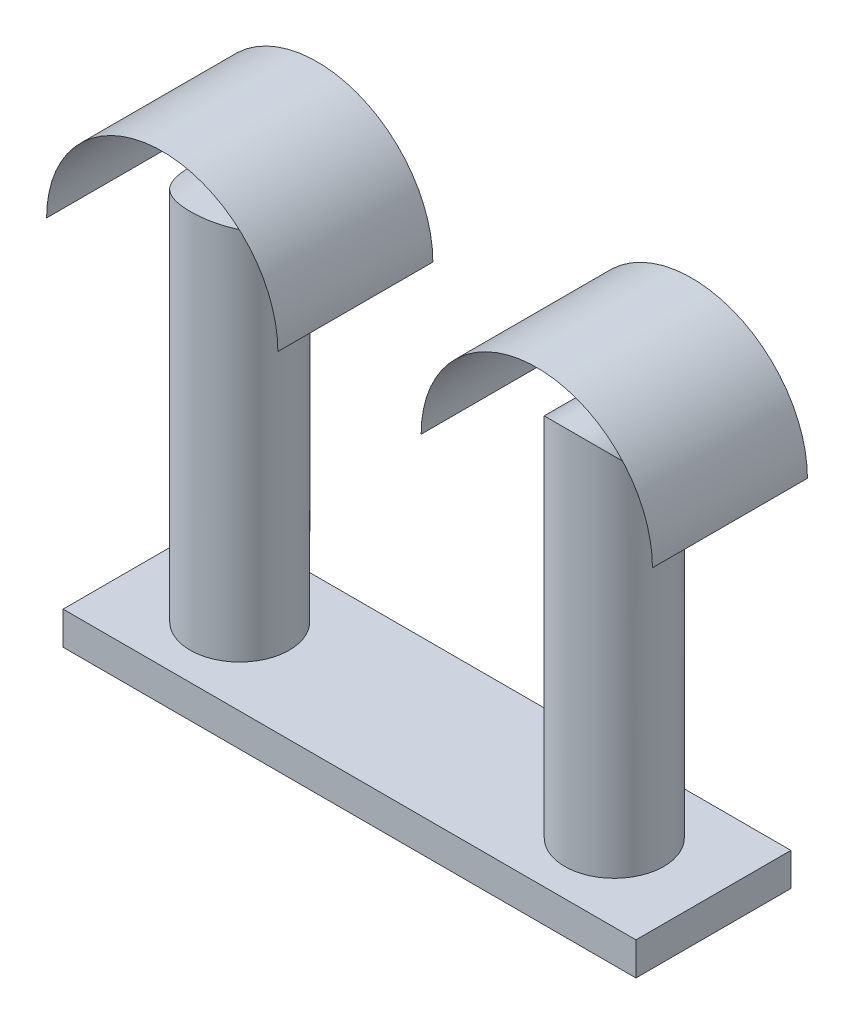
ISO-10303-21;
HEADER;
FILE_DESCRIPTION(('STEP AP214'),'2;1');
FILE_NAME('part.step','',(''),(''),'','','');
FILE_SCHEMA(('AUTOMOTIVE_DESIGN { 1 0 10303 214 1 1 1 1 }'));
ENDSEC;
DATA;
#1=APPLICATION_CONTEXT('core data for automotive mechanical design processes');
#2=APPLICATION_PROTOCOL_DEFINITION('international standard','automotive_design',2000,#1);
#3=PRODUCT_CONTEXT('',#1,'mechanical');
#4=PRODUCT('Part','Part','',(#3));
#5=PRODUCT_RELATED_PRODUCT_CATEGORY('part','',(#4));
#6=PRODUCT_DEFINITION_FORMATION('','',#4);
#7=PRODUCT_DEFINITION_CONTEXT('part definition',#1,'design');
#8=PRODUCT_DEFINITION('design','',#6,#7);
#9=PRODUCT_DEFINITION_SHAPE('','',#8);
#10=(LENGTH_UNIT() NAMED_UNIT(*) SI_UNIT(.MILLI.,.METRE.));
#11=(NAMED_UNIT(*) PLANE_ANGLE_UNIT() SI_UNIT($,.RADIAN.));
#12=(NAMED_UNIT(*) SI_UNIT($,.STERADIAN.) SOLID_ANGLE_UNIT());
#13=UNCERTAINTY_MEASURE_WITH_UNIT(LENGTH_MEASURE(1.E-05),#10,'distance_accuracy_value','');
#14=(GEOMETRIC_REPRESENTATION_CONTEXT(3) GLOBAL_UNCERTAINTY_ASSIGNED_CONTEXT((#13)) GLOBAL_UNIT_ASSIGNED_CONTEXT((#10,
#11,#12)) REPRESENTATION_CONTEXT('',''));
#15=CARTESIAN_POINT('',(0.,0.,0.));
#16=DIRECTION('',(0.,0.,1.));
#17=DIRECTION('',(1.,0.,0.));
#18=AXIS2_PLACEMENT_3D('',#15,#16,#17);
#19=CARTESIAN_POINT('',(56.6767208133692,110.,0.));
#20=DIRECTION('',(0.,0.,1.));
#21=DIRECTION('',(-1.,0.,0.));
#22=AXIS2_PLACEMENT_3D('',#19,#20,#21);
#23=CYLINDRICAL_SURFACE('',#22,35.);
#24=CARTESIAN_POINT('',(56.6767208133692,110.,23.447135678392));
#25=DIRECTION('',(0.,0.,1.));
#26=DIRECTION('',(1.,0.,0.));
#27=AXIS2_PLACEMENT_3D('',#24,#25,#26);
#28=CIRCLE('',#27,35.);
#29=CARTESIAN_POINT('',(91.6767208133692,110.,23.447135678392));
#30=VERTEX_POINT('',#29);
#31=CARTESIAN_POINT('',(21.6767208133692,110.,23.447135678392));
#32=VERTEX_POINT('',#31);
#33=EDGE_CURVE('E73',#30,#32,#28,.T.);
#34=ORIENTED_EDGE('',*,*,#33,.T.);
#35=DIRECTION('',(0.,0.,1.));
#36=VECTOR('',#35,1.);
#37=CARTESIAN_POINT('',(21.6767208133692,110.,0.));
#38=LINE('',#37,#36);
#39=CARTESIAN_POINT('',(21.6767208133692,110.,-23.447135678392));
#40=VERTEX_POINT('',#39);
#41=EDGE_CURVE('E14',#40,#32,#38,.T.);
#42=ORIENTED_EDGE('',*,*,#41,.F.);
#43=CARTESIAN_POINT('',(56.6767208133692,110.,-23.447135678392));
#44=DIRECTION('',(0.,0.,1.));
#45=DIRECTION('',(1.,0.,0.));
#46=AXIS2_PLACEMENT_3D('',#43,#44,#45);
#47=CIRCLE('',#46,35.);
#48=CARTESIAN_POINT('',(91.6767208133692,110.,-23.447135678392));
#49=VERTEX_POINT('',#48);
#50=EDGE_CURVE('E74',#49,#40,#47,.T.);
#51=ORIENTED_EDGE('',*,*,#50,.F.);
#52=DIRECTION('',(0.,0.,1.));
#53=VECTOR('',#52,1.);
#54=CARTESIAN_POINT('',(91.6767208133692,110.,0.));
#55=LINE('',#54,#53);
#56=EDGE_CURVE('E54',#49,#30,#55,.T.);
#57=ORIENTED_EDGE('',*,*,#56,.T.);
#58=EDGE_LOOP('',(#34,#42,#51,#57));
#59=FACE_BOUND('',#58,.T.);
#60=ADVANCED_FACE('F53',(#59),#23,.F.);
#61=OPEN_SHELL('',(#60));
#62=SHELL_BASED_SURFACE_MODEL('B2',(#61));
#63=CARTESIAN_POINT('',(-56.6767208133692,110.,0.));
#64=DIRECTION('',(0.,0.,1.));
#65=DIRECTION('',(1.,0.,0.));
#66=AXIS2_PLACEMENT_3D('',#63,#64,#65);
#67=CYLINDRICAL_SURFACE('',#66,35.);
#68=CARTESIAN_POINT('',(-56.6767208133692,110.,23.447135678392));
#69=DIRECTION('',(0.,0.,-1.));
#70=DIRECTION('',(-1.,0.,0.));
#71=AXIS2_PLACEMENT_3D('',#68,#69,#70);
#72=CIRCLE('',#71,35.);
#73=CARTESIAN_POINT('',(-91.6767208133692,110.,23.447135678392));
#74=VERTEX_POINT('',#73);
#75=CARTESIAN_POINT('',(-21.6767208133692,110.,23.447135678392));
#76=VERTEX_POINT('',#75);
#77=EDGE_CURVE('E117',#74,#76,#72,.T.);
#78=ORIENTED_EDGE('',*,*,#77,.F.);
#79=DIRECTION('',(0.,0.,1.));
#80=VECTOR('',#79,1.);
#81=CARTESIAN_POINT('',(-91.6767208133692,110.,0.));
#82=LINE('',#81,#80);
#83=CARTESIAN_POINT('',(-91.6767208133692,110.,-23.447135678392));
#84=VERTEX_POINT('',#83);
#85=EDGE_CURVE('E109',#84,#74,#82,.T.);
#86=ORIENTED_EDGE('',*,*,#85,.F.);
#87=CARTESIAN_POINT('',(-56.6767208133692,110.,-23.447135678392));
#88=DIRECTION('',(0.,0.,-1.));
#89=DIRECTION('',(-1.,0.,0.));
#90=AXIS2_PLACEMENT_3D('',#87,#88,#89);
#91=CIRCLE('',#90,35.);
#92=CARTESIAN_POINT('',(-21.6767208133692,110.,-23.447135678392));
#93=VERTEX_POINT('',#92);
#94=EDGE_CURVE('E127',#84,#93,#91,.T.);
#95=ORIENTED_EDGE('',*,*,#94,.T.);
#96=DIRECTION('',(0.,0.,1.));
#97=VECTOR('',#96,1.);
#98=CARTESIAN_POINT('',(-21.6767208133692,110.,0.));
#99=LINE('',#98,#97);
#100=EDGE_CURVE('E51',#93,#76,#99,.T.);
#101=ORIENTED_EDGE('',*,*,#100,.T.);
#102=EDGE_LOOP('',(#78,#86,#95,#101));
#103=FACE_BOUND('',#102,.T.);
#104=ADVANCED_FACE('F108',(#103),#67,.F.);
#105=OPEN_SHELL('',(#104));
#106=SHELL_BASED_SURFACE_MODEL('B8',(#105));
#107=CARTESIAN_POINT('',(86.6767208133692,10.,-23.447135678392));
#108=DIRECTION('',(0.,-1.,0.));
#109=DIRECTION('',(0.,0.,-1.));
#110=AXIS2_PLACEMENT_3D('',#107,#108,#109);
#111=PLANE('',#110);
#112=CARTESIAN_POINT('',(-56.6767208133692,10.,0.));
#113=DIRECTION('',(0.,-1.,0.));
#114=DIRECTION('',(0.,0.,-1.));
#115=AXIS2_PLACEMENT_3D('',#112,#113,#114);
#116=CIRCLE('',#115,15.);
#117=CARTESIAN_POINT('',(-56.6767208133692,10.,-15.));
#118=VERTEX_POINT('',#117);
#119=EDGE_CURVE('E162',#118,#118,#116,.F.);
#120=ORIENTED_EDGE('',*,*,#119,.F.);
#121=EDGE_LOOP('',(#120));
#122=FACE_BOUND('',#121,.T.);
#123=DIRECTION('',(0.,0.,-1.));
#124=VECTOR('',#123,1.);
#125=CARTESIAN_POINT('',(86.6767208133692,10.,23.447135678392));
#126=LINE('',#125,#124);
#127=CARTESIAN_POINT('',(86.6767208133692,10.,23.447135678392));
#128=VERTEX_POINT('',#127);
#129=CARTESIAN_POINT('',(86.6767208133692,10.,-23.447135678392));
#130=VERTEX_POINT('',#129);
#131=EDGE_CURVE('E229',#128,#130,#126,.T.);
#132=ORIENTED_EDGE('',*,*,#131,.T.);
#133=DIRECTION('',(-1.,0.,0.));
#134=VECTOR('',#133,1.);
#135=CARTESIAN_POINT('',(-86.6767208133692,10.,-23.447135678392));
#136=LINE('',#135,#134);
#137=CARTESIAN_POINT('',(-86.6767208133692,10.,-23.447135678392));
#138=VERTEX_POINT('',#137);
#139=EDGE_CURVE('E202',#130,#138,#136,.T.);
#140=ORIENTED_EDGE('',*,*,#139,.T.);
#141=DIRECTION('',(0.,0.,1.));
#142=VECTOR('',#141,1.);
#143=CARTESIAN_POINT('',(-86.6767208133692,10.,23.447135678392));
#144=LINE('',#143,#142);
#145=CARTESIAN_POINT('',(-86.6767208133692,10.,23.447135678392));
#146=VERTEX_POINT('',#145);
#147=EDGE_CURVE('E273',#138,#146,#144,.T.);
#148=ORIENTED_EDGE('',*,*,#147,.T.);
#149=DIRECTION('',(1.,0.,0.));
#150=VECTOR('',#149,1.);
#151=CARTESIAN_POINT('',(-86.6767208133692,10.,23.447135678392));
#152=LINE('',#151,#150);
#153=EDGE_CURVE('E170',#146,#128,#152,.T.);
#154=ORIENTED_EDGE('',*,*,#153,.T.);
#155=EDGE_LOOP('',(#132,#140,#148,#154));
#156=FACE_BOUND('',#155,.T.);
#157=CARTESIAN_POINT('',(56.6767208133692,10.,0.));
#158=DIRECTION('',(0.,-1.,0.));
#159=DIRECTION('',(0.,0.,-1.));
#160=AXIS2_PLACEMENT_3D('',#157,#158,#159);
#161=CIRCLE('',#160,15.);
#162=CARTESIAN_POINT('',(56.6767208133692,10.,-15.));
#163=VERTEX_POINT('',#162);
#164=EDGE_CURVE('E106',#163,#163,#161,.F.);
#165=ORIENTED_EDGE('',*,*,#164,.F.);
#166=EDGE_LOOP('',(#165));
#167=FACE_BOUND('',#166,.T.);
#168=ADVANCED_FACE('F153',(#122,#156,#167),#111,.F.);
#169=CARTESIAN_POINT('',(86.6767208133692,10.,23.447135678392));
#170=DIRECTION('',(-1.,0.,0.));
#171=DIRECTION('',(0.,0.,1.));
#172=AXIS2_PLACEMENT_3D('',#169,#170,#171);
#173=PLANE('',#172);
#174=DIRECTION('',(0.,0.,-1.));
#175=VECTOR('',#174,1.);
#176=CARTESIAN_POINT('',(86.6767208133692,0.,23.447135678392));
#177=LINE('',#176,#175);
#178=CARTESIAN_POINT('',(86.6767208133692,0.,23.447135678392));
#179=VERTEX_POINT('',#178);
#180=CARTESIAN_POINT('',(86.6767208133692,0.,-23.447135678392));
#181=VERTEX_POINT('',#180);
#182=EDGE_CURVE('E228',#179,#181,#177,.T.);
#183=ORIENTED_EDGE('',*,*,#182,.T.);
#184=DIRECTION('',(0.,-1.,0.));
#185=VECTOR('',#184,1.);
#186=CARTESIAN_POINT('',(86.6767208133692,10.,-23.447135678392));
#187=LINE('',#186,#185);
#188=EDGE_CURVE('E269',#130,#181,#187,.T.);
#189=ORIENTED_EDGE('',*,*,#188,.F.);
#190=ORIENTED_EDGE('',*,*,#131,.F.);
#191=DIRECTION('',(0.,-1.,0.));
#192=VECTOR('',#191,1.);
#193=CARTESIAN_POINT('',(86.6767208133692,10.,23.447135678392));
#194=LINE('',#193,#192);
#195=EDGE_CURVE('E280',#128,#179,#194,.T.);
#196=ORIENTED_EDGE('',*,*,#195,.T.);
#197=EDGE_LOOP('',(#183,#189,#190,#196));
#198=FACE_BOUND('',#197,.T.);
#199=ADVANCED_FACE('F155',(#198),#173,.F.);
#200=CARTESIAN_POINT('',(-86.6767208133692,10.,-23.447135678392));
#201=DIRECTION('',(0.,0.,1.));
#202=DIRECTION('',(1.,0.,0.));
#203=AXIS2_PLACEMENT_3D('',#200,#201,#202);
#204=PLANE('',#203);
#205=DIRECTION('',(-1.,0.,0.));
#206=VECTOR('',#205,1.);
#207=CARTESIAN_POINT('',(-86.6767208133692,0.,-23.447135678392));
#208=LINE('',#207,#206);
#209=CARTESIAN_POINT('',(-86.6767208133692,0.,-23.447135678392));
#210=VERTEX_POINT('',#209);
#211=EDGE_CURVE('E265',#181,#210,#208,.T.);
#212=ORIENTED_EDGE('',*,*,#211,.T.);
#213=DIRECTION('',(0.,-1.,0.));
#214=VECTOR('',#213,1.);
#215=CARTESIAN_POINT('',(-86.6767208133692,10.,-23.447135678392));
#216=LINE('',#215,#214);
#217=EDGE_CURVE('E266',#138,#210,#216,.T.);
#218=ORIENTED_EDGE('',*,*,#217,.F.);
#219=ORIENTED_EDGE('',*,*,#139,.F.);
#220=ORIENTED_EDGE('',*,*,#188,.T.);
#221=EDGE_LOOP('',(#212,#218,#219,#220));
#222=FACE_BOUND('',#221,.T.);
#223=ADVANCED_FACE('F249',(#222),#204,.F.);
#224=CARTESIAN_POINT('',(-86.6767208133692,10.,23.447135678392));
#225=DIRECTION('',(1.,0.,0.));
#226=DIRECTION('',(0.,0.,-1.));
#227=AXIS2_PLACEMENT_3D('',#224,#225,#226);
#228=PLANE('',#227);
#229=DIRECTION('',(0.,0.,1.));
#230=VECTOR('',#229,1.);
#231=CARTESIAN_POINT('',(-86.6767208133692,0.,23.447135678392));
#232=LINE('',#231,#230);
#233=CARTESIAN_POINT('',(-86.6767208133692,0.,23.447135678392));
#234=VERTEX_POINT('',#233);
#235=EDGE_CURVE('E188',#210,#234,#232,.T.);
#236=ORIENTED_EDGE('',*,*,#235,.T.);
#237=DIRECTION('',(0.,-1.,0.));
#238=VECTOR('',#237,1.);
#239=CARTESIAN_POINT('',(-86.6767208133692,10.,23.447135678392));
#240=LINE('',#239,#238);
#241=EDGE_CURVE('E274',#146,#234,#240,.T.);
#242=ORIENTED_EDGE('',*,*,#241,.F.);
#243=ORIENTED_EDGE('',*,*,#147,.F.);
#244=ORIENTED_EDGE('',*,*,#217,.T.);
#245=EDGE_LOOP('',(#236,#242,#243,#244));
#246=FACE_BOUND('',#245,.T.);
#247=ADVANCED_FACE('F260',(#246),#228,.F.);
#248=CARTESIAN_POINT('',(-86.6767208133692,10.,23.447135678392));
#249=DIRECTION('',(0.,0.,-1.));
#250=DIRECTION('',(-1.,0.,0.));
#251=AXIS2_PLACEMENT_3D('',#248,#249,#250);
#252=PLANE('',#251);
#253=DIRECTION('',(1.,0.,0.));
#254=VECTOR('',#253,1.);
#255=CARTESIAN_POINT('',(-86.6767208133692,0.,23.447135678392));
#256=LINE('',#255,#254);
#257=EDGE_CURVE('E194',#234,#179,#256,.T.);
#258=ORIENTED_EDGE('',*,*,#257,.T.);
#259=ORIENTED_EDGE('',*,*,#195,.F.);
#260=ORIENTED_EDGE('',*,*,#153,.F.);
#261=ORIENTED_EDGE('',*,*,#241,.T.);
#262=EDGE_LOOP('',(#258,#259,#260,#261));
#263=FACE_BOUND('',#262,.T.);
#264=ADVANCED_FACE('F256',(#263),#252,.F.);
#265=CARTESIAN_POINT('',(86.6767208133692,0.,-23.447135678392));
#266=DIRECTION('',(0.,-1.,0.));
#267=DIRECTION('',(0.,0.,-1.));
#268=AXIS2_PLACEMENT_3D('',#265,#266,#267);
#269=PLANE('',#268);
#270=ORIENTED_EDGE('',*,*,#182,.F.);
#271=ORIENTED_EDGE('',*,*,#257,.F.);
#272=ORIENTED_EDGE('',*,*,#235,.F.);
#273=ORIENTED_EDGE('',*,*,#211,.F.);
#274=EDGE_LOOP('',(#270,#271,#272,#273));
#275=FACE_BOUND('',#274,.T.);
#276=ADVANCED_FACE('F253',(#275),#269,.T.);
#277=CARTESIAN_POINT('',(-56.6767208133692,165.001,0.));
#278=DIRECTION('',(0.,-1.,0.));
#279=DIRECTION('',(0.,0.,-1.));
#280=AXIS2_PLACEMENT_3D('',#277,#278,#279);
#281=CYLINDRICAL_SURFACE('',#280,15.);
#282=CARTESIAN_POINT('',(-56.6767208133692,125.,-15.));
#283=CARTESIAN_POINT('',(-56.2758116085755,124.999997634451,-14.9999971028977));
#284=CARTESIAN_POINT('',(-55.8747809147148,124.993093096144,-14.9839057227127));
#285=CARTESIAN_POINT('',(-55.0755880278513,124.965646471196,-14.9196934222328));
#286=CARTESIAN_POINT('',(-54.6774277240484,124.945096108048,-14.8715530634502));
#287=CARTESIAN_POINT('',(-53.8862021914042,124.890838083902,-14.7436069813925));
#288=CARTESIAN_POINT('',(-53.4931505179837,124.857100779284,-14.6637299087693));
#289=CARTESIAN_POINT('',(-52.7159437331125,124.777361238962,-14.4731590908052));
#290=CARTESIAN_POINT('',(-52.3317873210481,124.731360808766,-14.3624698818504));
#291=CARTESIAN_POINT('',(-51.5761819448873,124.628447823576,-14.1117825882951));
#292=CARTESIAN_POINT('',(-51.2046936023486,124.571573586006,-13.9718872663802));
#293=CARTESIAN_POINT('',(-50.4753046719846,124.448211405693,-13.6637911276681));
#294=CARTESIAN_POINT('',(-50.1174045429633,124.381723138698,-13.4955893561477));
#295=CARTESIAN_POINT('',(-49.4174207225811,124.240764734743,-13.1323253556836));
#296=CARTESIAN_POINT('',(-49.0753284867496,124.166298983741,-12.9372778696783));
#297=CARTESIAN_POINT('',(-48.40841435019,124.011062804148,-12.5215646090269));
#298=CARTESIAN_POINT('',(-48.0835992778295,123.93028991349,-12.3008888135201));
#299=CARTESIAN_POINT('',(-47.4379000241457,123.760345152856,-11.8242471126512));
#300=CARTESIAN_POINT('',(-47.1179455192611,123.670956371983,-11.5670986993325));
#301=CARTESIAN_POINT('',(-46.5005755769569,123.489544755253,-11.0278766636861));
#302=CARTESIAN_POINT('',(-46.2031610398894,123.397521814377,-10.7458020466626));
#303=CARTESIAN_POINT('',(-45.6323140306446,123.213116340039,-10.1581955454738));
#304=CARTESIAN_POINT('',(-45.3588923762962,123.120733663788,-9.85265319550503));
#305=CARTESIAN_POINT('',(-44.8376558227873,122.938015089041,-9.21979517345946));
#306=CARTESIAN_POINT('',(-44.5898451609618,122.847679531165,-8.89247591307435));
#307=CARTESIAN_POINT('',(-44.1089484899089,122.666811315426,-8.19988511704808));
#308=CARTESIAN_POINT('',(-43.8773403122041,122.576522266972,-7.83352144574261));
#309=CARTESIAN_POINT('',(-43.4461006225389,122.403775239088,-7.08086972568147));
#310=CARTESIAN_POINT('',(-43.2464558188307,122.321314010352,-6.69459004766711));
#311=CARTESIAN_POINT('',(-42.8808216371814,122.166948369086,-5.90445692298584));
#312=CARTESIAN_POINT('',(-42.7148256647425,122.0950418888,-5.50060693862803));
#313=CARTESIAN_POINT('',(-42.4181548910354,121.964349124141,-4.67807553747722));
#314=CARTESIAN_POINT('',(-42.2874772875275,121.90556179893,-4.25939530033326));
#315=CARTESIAN_POINT('',(-42.0685912473958,121.805915903134,-3.43169282787982));
#316=CARTESIAN_POINT('',(-41.9785838463539,121.764306961467,-3.02323680646861));
#317=CARTESIAN_POINT('',(-41.832879681194,121.696480380023,-2.19897823975667));
#318=CARTESIAN_POINT('',(-41.7771818030581,121.670262240514,-1.7831759334382));
#319=CARTESIAN_POINT('',(-41.7008286474494,121.634229006353,-0.947870034309885));
#320=CARTESIAN_POINT('',(-41.6801553697711,121.624405486047,-0.528368454171488));
#321=CARTESIAN_POINT('',(-41.674074213912,121.621521472551,0.310936168661081));
#322=CARTESIAN_POINT('',(-41.688664313294,121.628460018016,0.730739192686285));
#323=CARTESIAN_POINT('',(-41.7502627319354,121.657571896765,1.53266432819571));
#324=CARTESIAN_POINT('',(-41.7945104156763,121.67844732956,1.91504971890981));
#325=CARTESIAN_POINT('',(-41.9120510302775,121.733400897355,2.67433973371362));
#326=CARTESIAN_POINT('',(-41.9853421208894,121.767478195855,3.05124470348546));
#327=CARTESIAN_POINT('',(-42.1602324494522,121.847775493882,3.7971494165942));
#328=CARTESIAN_POINT('',(-42.2618359318705,121.893997314003,4.16614796569672));
#329=CARTESIAN_POINT('',(-42.4923982714144,121.997201882397,4.89394777063985));
#330=CARTESIAN_POINT('',(-42.6213582518477,122.054185072541,5.25274860705756));
#331=CARTESIAN_POINT('',(-42.9086212154579,122.178633361231,5.96576381897689));
#332=CARTESIAN_POINT('',(-43.067497343506,122.246298115433,6.31971214406214));
#333=CARTESIAN_POINT('',(-43.4115086044237,122.389332205218,7.01313102518094));
#334=CARTESIAN_POINT('',(-43.5966532779829,122.464704337318,7.35259626245836));
#335=CARTESIAN_POINT('',(-43.9919414926255,122.621182508269,8.01531402111064));
#336=CARTESIAN_POINT('',(-44.2020885720642,122.70228935804,8.33856423850204));
#337=CARTESIAN_POINT('',(-44.6461227058745,122.868235159902,8.96732162597828));
#338=CARTESIAN_POINT('',(-44.8800111701365,122.953074333469,9.2728277406277));
#339=CARTESIAN_POINT('',(-45.3924177970471,123.132229624603,9.89141119322043));
#340=CARTESIAN_POINT('',(-45.6730586458068,123.226710275972,10.2026855874592));
#341=CARTESIAN_POINT('',(-46.2593461837887,123.415162315944,10.8006280214367));
#342=CARTESIAN_POINT('',(-46.5649832388752,123.509133886008,11.0873054549483));
#343=CARTESIAN_POINT('',(-47.1999074929582,123.694204378846,11.63468111987));
#344=CARTESIAN_POINT('',(-47.5292108079579,123.78530128213,11.8953613539543));
#345=CARTESIAN_POINT('',(-48.2093334354355,123.962136973549,12.388694942433));
#346=CARTESIAN_POINT('',(-48.560143930168,124.047877928846,12.6213596684842));
#347=CARTESIAN_POINT('',(-49.2908021597841,124.213917556278,13.0627356288116));
#348=CARTESIAN_POINT('',(-49.6711679204257,124.294016579624,13.2706661044412));
#349=CARTESIAN_POINT('',(-50.4501435156774,124.443969502434,13.6535001893838));
#350=CARTESIAN_POINT('',(-50.8487538616367,124.513823114514,13.8284028723068));
#351=CARTESIAN_POINT('',(-51.6612178596173,124.641214015609,14.1433536056612));
#352=CARTESIAN_POINT('',(-52.0750642075612,124.69875711839,14.2834181138911));
#353=CARTESIAN_POINT('',(-52.9149833033869,124.799830197289,14.5272333690389));
#354=CARTESIAN_POINT('',(-53.3410550580567,124.843361308273,14.6309870569201));
#355=CARTESIAN_POINT('',(-54.173404952849,124.912692937453,14.7953129573531));
#356=CARTESIAN_POINT('',(-54.5791282543,124.939475775282,14.8582874330692));
#357=CARTESIAN_POINT('',(-55.3950502000146,124.978909363498,14.9507813281944));
#358=CARTESIAN_POINT('',(-55.8052486467177,124.991560735206,14.980302218466));
#359=CARTESIAN_POINT('',(-56.6267640915883,125.002374493608,15.005543922874));
#360=CARTESIAN_POINT('',(-57.0380807633573,125.000540731742,15.0012737216944));
#361=CARTESIAN_POINT('',(-57.8586509463046,124.982444741306,14.9590042429796));
#362=CARTESIAN_POINT('',(-58.2679045081155,124.96618286858,14.9210057972924));
#363=CARTESIAN_POINT('',(-59.0594520604372,124.920929424372,14.8146373636525));
#364=CARTESIAN_POINT('',(-59.4420211100135,124.892661885311,14.7479925605796));
#365=CARTESIAN_POINT('',(-60.1998166659836,124.824309318769,14.5855390009375));
#366=CARTESIAN_POINT('',(-60.5750434972573,124.784224815433,14.4897315378825));
#367=CARTESIAN_POINT('',(-61.3157828222951,124.693203624797,14.2698418703057));
#368=CARTESIAN_POINT('',(-61.6812946180906,124.642266160134,14.1457576403614));
#369=CARTESIAN_POINT('',(-62.4004015832282,124.53073835597,13.8703904493411));
#370=CARTESIAN_POINT('',(-62.7539963057606,124.470147655025,13.7191064698023));
#371=CARTESIAN_POINT('',(-63.4581208290873,124.338678707203,13.385406206504));
#372=CARTESIAN_POINT('',(-63.8082111181583,124.267538552431,13.2021661345154));
#373=CARTESIAN_POINT('',(-64.4917248572631,124.118149326582,12.8094141074702));
#374=CARTESIAN_POINT('',(-64.825148089274,124.039900162549,12.5999018088704));
#375=CARTESIAN_POINT('',(-65.4737026791421,123.878087948428,12.1559683845409));
#376=CARTESIAN_POINT('',(-65.7888304617334,123.794523866349,11.9215424153894));
#377=CARTESIAN_POINT('',(-66.3993040161893,123.623977639026,11.4291394853869));
#378=CARTESIAN_POINT('',(-66.6946426422483,123.536994276888,11.1711540959113));
#379=CARTESIAN_POINT('',(-67.2854534710176,123.355020393816,10.6128306672508));
#380=CARTESIAN_POINT('',(-67.5792629109147,123.259919933508,10.3107664145056));
#381=CARTESIAN_POINT('',(-68.1405896598843,123.070643621218,9.68282409554338));
#382=CARTESIAN_POINT('',(-68.4081052182083,122.976467831179,9.35694444612046));
#383=CARTESIAN_POINT('',(-68.9153204688366,122.791608499054,8.68300744349923));
#384=CARTESIAN_POINT('',(-69.1550066683547,122.700926665096,8.3349394581431));
#385=CARTESIAN_POINT('',(-69.6046822649374,122.52577490566,7.61882491992748));
#386=CARTESIAN_POINT('',(-69.8146834740798,122.441302515815,7.2507863947611));
#387=CARTESIAN_POINT('',(-70.2070119722322,122.279669773049,6.48982121542064));
#388=CARTESIAN_POINT('',(-70.3887637561466,122.202671150157,6.09656276668586));
#389=CARTESIAN_POINT('',(-70.7181761612097,122.060407928251,5.29393031447576));
#390=CARTESIAN_POINT('',(-70.8658360723689,121.995143573618,4.88455597558242));
#391=CARTESIAN_POINT('',(-71.1253553074282,121.878789208411,4.05296544860186));
#392=CARTESIAN_POINT('',(-71.237241193607,121.827688684936,3.63075904462069));
#393=CARTESIAN_POINT('',(-71.4239707718343,121.741601053176,2.77662714515813));
#394=CARTESIAN_POINT('',(-71.4988182390048,121.706612302731,2.34470264488225));
#395=CARTESIAN_POINT('',(-71.6059768679522,121.656286903911,1.50993157223082));
#396=CARTESIAN_POINT('',(-71.6412259362293,121.639595565445,1.10754156609759));
#397=CARTESIAN_POINT('',(-71.679135978202,121.621638128549,0.300893194252106));
#398=CARTESIAN_POINT('',(-71.6817987747836,121.620371167274,-0.103365065683848));
#399=CARTESIAN_POINT('',(-71.6545073089384,121.633307294592,-0.910458860891984));
#400=CARTESIAN_POINT('',(-71.62455817919,121.647507948789,-1.31329461003873));
#401=CARTESIAN_POINT('',(-71.5324176507138,121.69086390456,-2.11443773086924));
#402=CARTESIAN_POINT('',(-71.4702266060756,121.720019041899,-2.51274515223527));
#403=CARTESIAN_POINT('',(-71.3184048344406,121.790370856793,-3.28122050464564));
#404=CARTESIAN_POINT('',(-71.2303760989835,121.830859443076,-3.65177192197367));
#405=CARTESIAN_POINT('',(-71.0268674227224,121.923122675856,-4.38378879378302));
#406=CARTESIAN_POINT('',(-70.9113887158771,121.974896815026,-4.7452546558799));
#407=CARTESIAN_POINT('',(-70.653981017171,122.088252597642,-5.45705452049631));
#408=CARTESIAN_POINT('',(-70.5120509949847,122.149834623109,-5.80738808877086));
#409=CARTESIAN_POINT('',(-70.2027861505878,122.281167505237,-6.49521469661606));
#410=CARTESIAN_POINT('',(-70.0354414083795,122.350921549201,-6.83270265761525));
#411=CARTESIAN_POINT('',(-69.6654330930338,122.501317598122,-7.51349262789671));
#412=CARTESIAN_POINT('',(-69.4612265808578,122.58236597322,-7.85586655402996));
#413=CARTESIAN_POINT('',(-69.0268638960868,122.749474864047,-8.52245531298469));
#414=CARTESIAN_POINT('',(-68.7967060666094,122.835535699631,-8.84666898437015));
#415=CARTESIAN_POINT('',(-68.3117534978877,123.010490169659,-9.47542485845539));
#416=CARTESIAN_POINT('',(-68.0569529438744,123.099384469362,-9.77996238990001));
#417=CARTESIAN_POINT('',(-67.5240906390888,123.277823300155,-10.3678342956753));
#418=CARTESIAN_POINT('',(-67.2460250800635,123.3673679355,-10.6511651842493));
#419=CARTESIAN_POINT('',(-66.6451577505094,123.55199961966,-11.2166689652249));
#420=CARTESIAN_POINT('',(-66.3205571010921,123.646964241428,-11.4969744838624));
#421=CARTESIAN_POINT('',(-65.6478968541785,123.832523871896,-12.0292091427105));
#422=CARTESIAN_POINT('',(-65.2998456930033,123.923120432095,-12.2811484014768));
#423=CARTESIAN_POINT('',(-64.5819303083304,124.097568794343,-12.7551085647729));
#424=CARTESIAN_POINT('',(-64.2120501795994,124.181415570463,-12.9771072569516));
#425=CARTESIAN_POINT('',(-63.453019338882,124.339948303115,-13.3891080022126));
#426=CARTESIAN_POINT('',(-63.0638701692112,124.414634991172,-13.5791126107974));
#427=CARTESIAN_POINT('',(-62.2746744277684,124.551714351453,-13.9228390796253));
#428=CARTESIAN_POINT('',(-61.8748689981573,124.614270181822,-14.0770489076702));
#429=CARTESIAN_POINT('',(-61.06181265262,124.726637734283,-14.3511327196383));
#430=CARTESIAN_POINT('',(-60.6485595568162,124.776447378491,-14.471001105599));
#431=CARTESIAN_POINT('',(-59.8130562313591,124.861716449184,-14.6747337683809));
#432=CARTESIAN_POINT('',(-59.3908341744565,124.897215343119,-14.7586971067685));
#433=CARTESIAN_POINT('',(-58.5399569220998,124.952966275355,-14.8900443856005));
#434=CARTESIAN_POINT('',(-58.1113065670283,124.973229250635,-14.9374545660526));
#435=CARTESIAN_POINT('',(-57.5141865429358,124.990380124795,-14.9775419788666));
#436=CARTESIAN_POINT('',(-57.3468326008338,124.993985274424,-14.9859610717429));
#437=CARTESIAN_POINT('',(-57.0118997885815,124.998795713921,-14.9971907052544));
#438=CARTESIAN_POINT('',(-56.8443209170439,125.000000988918,-15.0000012111337));
#439=CARTESIAN_POINT('',(-56.6767208133692,125.,-15.));
#440=B_SPLINE_CURVE_WITH_KNOTS('',3,(#282,#283,#284,#285,#286,#287,#288,#289,#290,#291,#292,
#293,#294,#295,#296,#297,#298,#299,#300,#301,#302,#303,#304,#305,#306,#307,#308,#309,#310,#311,
#312,#313,#314,#315,#316,#317,#318,#319,#320,#321,#322,#323,#324,#325,#326,#327,#328,#329,#330,
#331,#332,#333,#334,#335,#336,#337,#338,#339,#340,#341,#342,#343,#344,#345,#346,#347,#348,#349,
#350,#351,#352,#353,#354,#355,#356,#357,#358,#359,#360,#361,#362,#363,#364,#365,#366,#367,#368,
#369,#370,#371,#372,#373,#374,#375,#376,#377,#378,#379,#380,#381,#382,#383,#384,#385,#386,#387,
#388,#389,#390,#391,#392,#393,#394,#395,#396,#397,#398,#399,#400,#401,#402,#403,#404,#405,#406,
#407,#408,#409,#410,#411,#412,#413,#414,#415,#416,#417,#418,#419,#420,#421,#422,#423,#424,#425,
#426,#427,#428,#429,#430,#431,#432,#433,#434,#435,#436,#437,#438,#439),.UNSPECIFIED.,.T.,.F.,(4,
2,2,2,2,2,2,2,2,2,2,2,2,2,2,2,2,2,2,2,2,2,2,2,2,2,2,2,2,2,2,2,2,2,2,2,2,2,2,2,2,2,2,2,2,2,2,2,2,
2,2,2,2,2,2,2,2,2,2,2,2,2,2,2,2,2,2,2,2,2,2,2,2,2,2,2,2,2,4),(0.,1.20255810032926,
2.40584624681178,3.6118550300242,4.81768634970269,6.01934433633629,7.22104286074873,
8.42208405869878,9.623596463967,10.8825284317712,12.1415106607473,13.4010576495404,
14.6608126977142,15.9873754678742,17.3133851551761,18.6391347193201,19.9647790645806,
21.2240419627037,22.4832639708525,23.7418386300454,25.0003411087527,26.1554931902543,
27.3105720907079,28.4658242486826,29.6211238525989,30.8013538050346,31.9820135174739,
33.1628405167638,34.3437376809421,35.6311581794671,36.9180847928986,38.205896223251,
39.493183148669,40.8139640437432,42.1347819796408,43.4549747616911,44.7750605911121,
46.007830975966,47.2405471571784,48.4729355835715,49.7052936161118,50.872023094988,
52.0387008309373,53.205462160552,54.3722671872795,55.5754618054366,56.7786721585551,
57.9821168550138,59.1859937956218,60.4804744563593,61.7750412503238,63.0702331039845,
64.3649081229038,65.6832297361386,67.0015788019589,68.3189467056942,69.6361803097093,
70.8474299990974,72.058611930496,73.269603265708,74.4805813017603,75.62833987932,
76.7760468714418,77.9237985781309,79.0719994377844,80.2911093175007,81.5102970763697,
82.7297732234988,83.9494493789151,85.2656822247904,86.581444058438,87.8981767239986,
89.2148041666267,90.5122627662226,91.8099327429977,93.1039989966859,94.3971354263023,
94.899861756635,95.402591202305),.UNSPECIFIED.);
#441=CARTESIAN_POINT('',(-56.6767208133692,125.,-15.));
#442=VERTEX_POINT('',#441);
#443=EDGE_CURVE('E215',#442,#442,#440,.T.);
#444=ORIENTED_EDGE('',*,*,#443,.T.);
#445=EDGE_LOOP('',(#444));
#446=FACE_BOUND('',#445,.T.);
#447=ORIENTED_EDGE('',*,*,#119,.T.);
#448=EDGE_LOOP('',(#447));
#449=FACE_BOUND('',#448,.T.);
#450=ADVANCED_FACE('F231',(#446,#449),#281,.T.);
#451=CARTESIAN_POINT('',(-56.6767208133692,90.,0.));
#452=DIRECTION('',(0.,0.,1.));
#453=DIRECTION('',(1.,0.,0.));
#454=AXIS2_PLACEMENT_3D('',#451,#452,#453);
#455=CYLINDRICAL_SURFACE('',#454,35.);
#456=ORIENTED_EDGE('',*,*,#443,.F.);
#457=EDGE_LOOP('',(#456));
#458=FACE_BOUND('',#457,.T.);
#459=ADVANCED_FACE('F234',(#458),#455,.T.);
#460=CARTESIAN_POINT('',(56.6767208133692,165.001,0.));
#461=DIRECTION('',(0.,-1.,0.));
#462=DIRECTION('',(0.,0.,-1.));
#463=AXIS2_PLACEMENT_3D('',#460,#461,#462);
#464=CYLINDRICAL_SURFACE('',#463,15.);
#465=CARTESIAN_POINT('',(56.6767208133692,110.,0.));
#466=DIRECTION('',(0.,-0.707106781186547,-0.707106781186548));
#467=DIRECTION('',(0.,-0.707106781186547,0.707106781186548));
#468=AXIS2_PLACEMENT_3D('',#465,#466,#467);
#469=ELLIPSE('',#468,21.2132034355964,15.);
#470=CARTESIAN_POINT('',(41.6767208133692,110.,0.));
#471=VERTEX_POINT('',#470);
#472=CARTESIAN_POINT('',(71.6767208133692,110.,0.));
#473=VERTEX_POINT('',#472);
#474=EDGE_CURVE('E213',#471,#473,#469,.T.);
#475=ORIENTED_EDGE('',*,*,#474,.T.);
#476=CARTESIAN_POINT('',(56.6767208133692,110.,0.));
#477=DIRECTION('',(0.,-0.707106781186547,0.707106781186548));
#478=DIRECTION('',(0.,-0.707106781186547,-0.707106781186548));
#479=AXIS2_PLACEMENT_3D('',#476,#477,#478);
#480=ELLIPSE('',#479,21.2132034355964,15.);
#481=EDGE_CURVE('E210',#473,#471,#480,.T.);
#482=ORIENTED_EDGE('',*,*,#481,.T.);
#483=EDGE_LOOP('',(#475,#482));
#484=FACE_BOUND('',#483,.T.);
#485=ORIENTED_EDGE('',*,*,#164,.T.);
#486=EDGE_LOOP('',(#485));
#487=FACE_BOUND('',#486,.T.);
#488=ADVANCED_FACE('F217',(#484,#487),#464,.T.);
#489=CARTESIAN_POINT('',(56.6767208133692,110.,0.));
#490=DIRECTION('',(0.,0.,1.));
#491=DIRECTION('',(-1.,0.,0.));
#492=AXIS2_PLACEMENT_3D('',#489,#490,#491);
#493=CYLINDRICAL_SURFACE('',#492,15.);
#494=ORIENTED_EDGE('',*,*,#474,.F.);
#495=ORIENTED_EDGE('',*,*,#481,.F.);
#496=EDGE_LOOP('',(#494,#495));
#497=FACE_BOUND('',#496,.T.);
#498=ADVANCED_FACE('F212',(#497),#493,.T.);
#499=CLOSED_SHELL('',(#168,#199,#223,#247,#264,#276,#450,#459,#488,#498));
#500=MANIFOLD_SOLID_BREP('B45',#499);
#501=ADVANCED_BREP_SHAPE_REPRESENTATION('',(#18,#500),#14);
#502=MANIFOLD_SURFACE_SHAPE_REPRESENTATION('',(#18,#62,#106),#14);
#503=SHAPE_REPRESENTATION('',(#18),#14);
#504=SHAPE_DEFINITION_REPRESENTATION(#9,#503);
#505=SHAPE_REPRESENTATION_RELATIONSHIP('','',#503,#501);
#506=SHAPE_REPRESENTATION_RELATIONSHIP('','',#503,#502);
ENDSEC;
END-ISO-10303-21;
